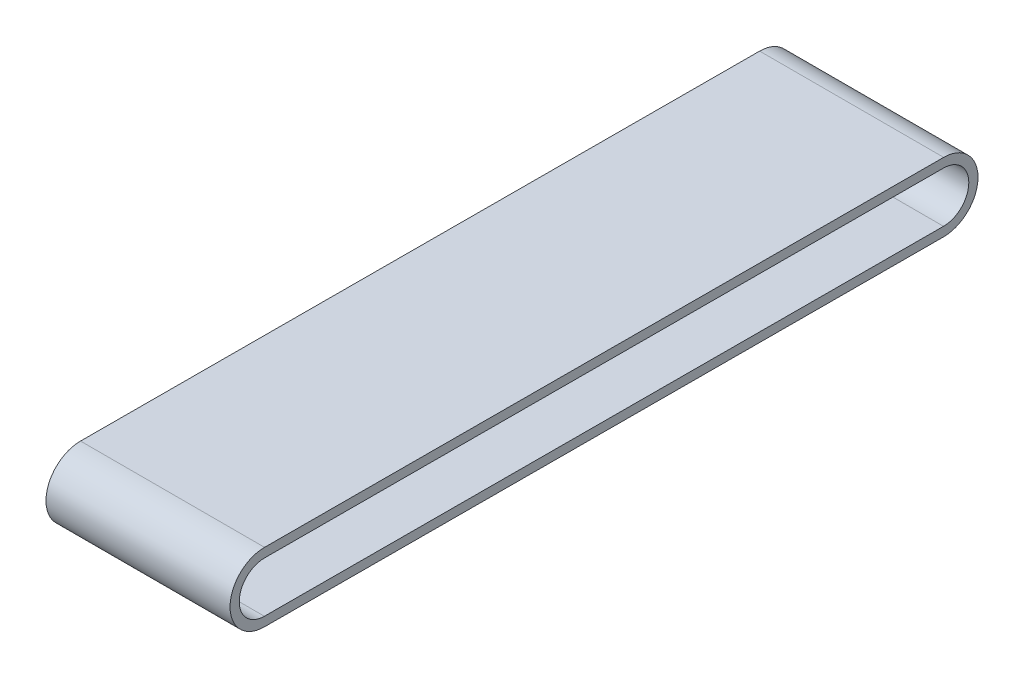
ISO-10303-21;
HEADER;
FILE_DESCRIPTION(('STEP AP214'),'2;1');
FILE_NAME('part.step','',(''),(''),'','','');
FILE_SCHEMA(('AUTOMOTIVE_DESIGN { 1 0 10303 214 1 1 1 1 }'));
ENDSEC;
DATA;
#1=APPLICATION_CONTEXT('core data for automotive mechanical design processes');
#2=APPLICATION_PROTOCOL_DEFINITION('international standard','automotive_design',2000,#1);
#3=PRODUCT_CONTEXT('',#1,'mechanical');
#4=PRODUCT('Part','Part','',(#3));
#5=PRODUCT_RELATED_PRODUCT_CATEGORY('part','',(#4));
#6=PRODUCT_DEFINITION_FORMATION('','',#4);
#7=PRODUCT_DEFINITION_CONTEXT('part definition',#1,'design');
#8=PRODUCT_DEFINITION('design','',#6,#7);
#9=PRODUCT_DEFINITION_SHAPE('','',#8);
#10=(LENGTH_UNIT() NAMED_UNIT(*) SI_UNIT(.MILLI.,.METRE.));
#11=(NAMED_UNIT(*) PLANE_ANGLE_UNIT() SI_UNIT($,.RADIAN.));
#12=(NAMED_UNIT(*) SI_UNIT($,.STERADIAN.) SOLID_ANGLE_UNIT());
#13=UNCERTAINTY_MEASURE_WITH_UNIT(LENGTH_MEASURE(1.E-05),#10,'distance_accuracy_value','');
#14=(GEOMETRIC_REPRESENTATION_CONTEXT(3) GLOBAL_UNCERTAINTY_ASSIGNED_CONTEXT((#13)) GLOBAL_UNIT_ASSIGNED_CONTEXT((#10,
#11,#12)) REPRESENTATION_CONTEXT('',''));
#15=CARTESIAN_POINT('',(0.,0.,0.));
#16=DIRECTION('',(0.,0.,1.));
#17=DIRECTION('',(1.,0.,0.));
#18=AXIS2_PLACEMENT_3D('',#15,#16,#17);
#19=CARTESIAN_POINT('',(50.8,81.28,-364.49));
#20=DIRECTION('',(1.,0.,0.));
#21=DIRECTION('',(0.,0.,-1.));
#22=AXIS2_PLACEMENT_3D('',#19,#20,#21);
#23=PLANE('',#22);
#24=CARTESIAN_POINT('',(50.8,81.28,-364.49));
#25=DIRECTION('',(1.,0.,0.));
#26=DIRECTION('',(0.,0.,-1.));
#27=AXIS2_PLACEMENT_3D('',#24,#25,#26);
#28=CIRCLE('',#27,18.9985840345285);
#29=CARTESIAN_POINT('',(50.8,100.278514269767,-364.541486488536));
#30=VERTEX_POINT('',#29);
#31=CARTESIAN_POINT('',(50.8,62.281485730233,-364.438513511464));
#32=VERTEX_POINT('',#31);
#33=EDGE_CURVE('E157',#30,#32,#28,.T.);
#34=ORIENTED_EDGE('',*,*,#33,.T.);
#35=DIRECTION('',(0.,-0.00271001714877075,-0.999996327896784));
#36=VECTOR('',#35,1.);
#37=CARTESIAN_POINT('',(50.8,62.281485730233,-364.438513511464));
#38=LINE('',#37,#36);
#39=CARTESIAN_POINT('',(50.8,61.2654857302334,-739.342513511464));
#40=VERTEX_POINT('',#39);
#41=EDGE_CURVE('E160',#32,#40,#38,.T.);
#42=ORIENTED_EDGE('',*,*,#41,.T.);
#43=CARTESIAN_POINT('',(50.8,80.2640000000005,-739.394));
#44=DIRECTION('',(1.,0.,0.));
#45=DIRECTION('',(0.,0.,-1.));
#46=AXIS2_PLACEMENT_3D('',#43,#44,#45);
#47=CIRCLE('',#46,18.9985840345286);
#48=CARTESIAN_POINT('',(50.8,99.2625142697675,-739.445486488536));
#49=VERTEX_POINT('',#48);
#50=EDGE_CURVE('E163',#40,#49,#47,.T.);
#51=ORIENTED_EDGE('',*,*,#50,.T.);
#52=DIRECTION('',(0.,0.00271001714877026,0.999996327896784));
#53=VECTOR('',#52,1.);
#54=CARTESIAN_POINT('',(50.8,99.2625142697675,-739.445486488536));
#55=LINE('',#54,#53);
#56=EDGE_CURVE('E165',#49,#30,#55,.T.);
#57=ORIENTED_EDGE('',*,*,#56,.T.);
#58=EDGE_LOOP('',(#34,#42,#51,#57));
#59=FACE_BOUND('',#58,.T.);
#60=DIRECTION('',(0.,-0.00271001714877075,-0.999996327896785));
#61=VECTOR('',#60,1.);
#62=CARTESIAN_POINT('',(50.8,67.3614670759487,-364.45228039858));
#63=LINE('',#62,#61);
#64=CARTESIAN_POINT('',(50.8,67.3614670759487,-364.45228039858));
#65=VERTEX_POINT('',#64);
#66=CARTESIAN_POINT('',(50.8,66.3454670759491,-739.35628039858));
#67=VERTEX_POINT('',#66);
#68=EDGE_CURVE('E129',#65,#67,#63,.T.);
#69=ORIENTED_EDGE('',*,*,#68,.F.);
#70=CARTESIAN_POINT('',(50.8,81.28,-364.49));
#71=DIRECTION('',(1.,0.,0.));
#72=DIRECTION('',(0.,0.,-1.));
#73=AXIS2_PLACEMENT_3D('',#70,#71,#72);
#74=CIRCLE('',#73,13.9185840345285);
#75=CARTESIAN_POINT('',(50.8,95.1985329240513,-364.52771960142));
#76=VERTEX_POINT('',#75);
#77=EDGE_CURVE('E121',#76,#65,#74,.T.);
#78=ORIENTED_EDGE('',*,*,#77,.F.);
#79=DIRECTION('',(0.,0.00271001714877026,0.999996327896785));
#80=VECTOR('',#79,1.);
#81=CARTESIAN_POINT('',(50.8,94.1825329240518,-739.43171960142));
#82=LINE('',#81,#80);
#83=CARTESIAN_POINT('',(50.8,94.1825329240518,-739.43171960142));
#84=VERTEX_POINT('',#83);
#85=EDGE_CURVE('E143',#84,#76,#82,.T.);
#86=ORIENTED_EDGE('',*,*,#85,.F.);
#87=CARTESIAN_POINT('',(50.8,80.2640000000005,-739.394));
#88=DIRECTION('',(1.,0.,0.));
#89=DIRECTION('',(0.,0.,-1.));
#90=AXIS2_PLACEMENT_3D('',#87,#88,#89);
#91=CIRCLE('',#90,13.9185840345286);
#92=EDGE_CURVE('E141',#67,#84,#91,.T.);
#93=ORIENTED_EDGE('',*,*,#92,.F.);
#94=EDGE_LOOP('',(#69,#78,#86,#93));
#95=FACE_BOUND('',#94,.T.);
#96=ADVANCED_FACE('F56',(#59,#95),#23,.T.);
#97=CARTESIAN_POINT('',(-50.8,81.28,-364.49));
#98=DIRECTION('',(1.,0.,0.));
#99=DIRECTION('',(0.,0.,-1.));
#100=AXIS2_PLACEMENT_3D('',#97,#98,#99);
#101=PLANE('',#100);
#102=CARTESIAN_POINT('',(-50.8,81.28,-364.49));
#103=DIRECTION('',(1.,0.,0.));
#104=DIRECTION('',(0.,0.,-1.));
#105=AXIS2_PLACEMENT_3D('',#102,#103,#104);
#106=CIRCLE('',#105,18.9985840345285);
#107=CARTESIAN_POINT('',(-50.8,100.278514269767,-364.541486488536));
#108=VERTEX_POINT('',#107);
#109=CARTESIAN_POINT('',(-50.8,62.281485730233,-364.438513511464));
#110=VERTEX_POINT('',#109);
#111=EDGE_CURVE('E137',#108,#110,#106,.T.);
#112=ORIENTED_EDGE('',*,*,#111,.F.);
#113=DIRECTION('',(0.,0.00271001714877026,0.999996327896784));
#114=VECTOR('',#113,1.);
#115=CARTESIAN_POINT('',(-50.8,99.2625142697675,-739.445486488536));
#116=LINE('',#115,#114);
#117=CARTESIAN_POINT('',(-50.8,99.2625142697675,-739.445486488536));
#118=VERTEX_POINT('',#117);
#119=EDGE_CURVE('E161',#118,#108,#116,.T.);
#120=ORIENTED_EDGE('',*,*,#119,.F.);
#121=CARTESIAN_POINT('',(-50.8,80.2640000000005,-739.394));
#122=DIRECTION('',(1.,0.,0.));
#123=DIRECTION('',(0.,0.,-1.));
#124=AXIS2_PLACEMENT_3D('',#121,#122,#123);
#125=CIRCLE('',#124,18.9985840345286);
#126=CARTESIAN_POINT('',(-50.8,61.2654857302334,-739.342513511464));
#127=VERTEX_POINT('',#126);
#128=EDGE_CURVE('E172',#127,#118,#125,.T.);
#129=ORIENTED_EDGE('',*,*,#128,.F.);
#130=DIRECTION('',(0.,-0.00271001714877075,-0.999996327896784));
#131=VECTOR('',#130,1.);
#132=CARTESIAN_POINT('',(-50.8,62.281485730233,-364.438513511464));
#133=LINE('',#132,#131);
#134=EDGE_CURVE('E170',#110,#127,#133,.T.);
#135=ORIENTED_EDGE('',*,*,#134,.F.);
#136=EDGE_LOOP('',(#112,#120,#129,#135));
#137=FACE_BOUND('',#136,.T.);
#138=CARTESIAN_POINT('',(-50.8,81.28,-364.49));
#139=DIRECTION('',(1.,0.,0.));
#140=DIRECTION('',(0.,0.,-1.));
#141=AXIS2_PLACEMENT_3D('',#138,#139,#140);
#142=CIRCLE('',#141,13.9185840345285);
#143=CARTESIAN_POINT('',(-50.8,95.1985329240513,-364.52771960142));
#144=VERTEX_POINT('',#143);
#145=CARTESIAN_POINT('',(-50.8,67.3614670759487,-364.45228039858));
#146=VERTEX_POINT('',#145);
#147=EDGE_CURVE('E79',#144,#146,#142,.T.);
#148=ORIENTED_EDGE('',*,*,#147,.T.);
#149=DIRECTION('',(0.,-0.00271001714877075,-0.999996327896785));
#150=VECTOR('',#149,1.);
#151=CARTESIAN_POINT('',(-50.8,67.3614670759487,-364.45228039858));
#152=LINE('',#151,#150);
#153=CARTESIAN_POINT('',(-50.8,66.3454670759491,-739.35628039858));
#154=VERTEX_POINT('',#153);
#155=EDGE_CURVE('E136',#146,#154,#152,.T.);
#156=ORIENTED_EDGE('',*,*,#155,.T.);
#157=CARTESIAN_POINT('',(-50.8,80.2640000000005,-739.394));
#158=DIRECTION('',(1.,0.,0.));
#159=DIRECTION('',(0.,0.,-1.));
#160=AXIS2_PLACEMENT_3D('',#157,#158,#159);
#161=CIRCLE('',#160,13.9185840345286);
#162=CARTESIAN_POINT('',(-50.8,94.1825329240518,-739.43171960142));
#163=VERTEX_POINT('',#162);
#164=EDGE_CURVE('E149',#154,#163,#161,.T.);
#165=ORIENTED_EDGE('',*,*,#164,.T.);
#166=DIRECTION('',(0.,0.00271001714877026,0.999996327896785));
#167=VECTOR('',#166,1.);
#168=CARTESIAN_POINT('',(-50.8,94.1825329240518,-739.43171960142));
#169=LINE('',#168,#167);
#170=EDGE_CURVE('E130',#163,#144,#169,.T.);
#171=ORIENTED_EDGE('',*,*,#170,.T.);
#172=EDGE_LOOP('',(#148,#156,#165,#171));
#173=FACE_BOUND('',#172,.T.);
#174=ADVANCED_FACE('F190',(#137,#173),#101,.F.);
#175=CARTESIAN_POINT('',(50.8,81.28,-364.49));
#176=DIRECTION('',(-1.,0.,0.));
#177=DIRECTION('',(0.,0.,1.));
#178=AXIS2_PLACEMENT_3D('',#175,#176,#177);
#179=CYLINDRICAL_SURFACE('',#178,18.9985840345285);
#180=ORIENTED_EDGE('',*,*,#111,.T.);
#181=DIRECTION('',(-1.,0.,0.));
#182=VECTOR('',#181,1.);
#183=CARTESIAN_POINT('',(50.8,62.281485730233,-364.438513511464));
#184=LINE('',#183,#182);
#185=EDGE_CURVE('E12',#32,#110,#184,.T.);
#186=ORIENTED_EDGE('',*,*,#185,.F.);
#187=ORIENTED_EDGE('',*,*,#33,.F.);
#188=DIRECTION('',(-1.,0.,0.));
#189=VECTOR('',#188,1.);
#190=CARTESIAN_POINT('',(50.8,100.278514269767,-364.541486488536));
#191=LINE('',#190,#189);
#192=EDGE_CURVE('E167',#30,#108,#191,.T.);
#193=ORIENTED_EDGE('',*,*,#192,.T.);
#194=EDGE_LOOP('',(#180,#186,#187,#193));
#195=FACE_BOUND('',#194,.T.);
#196=ADVANCED_FACE('F58',(#195),#179,.T.);
#197=CARTESIAN_POINT('',(50.8,62.281485730233,-364.438513511464));
#198=DIRECTION('',(0.,0.999996327896784,-0.00271001714877075));
#199=DIRECTION('',(0.,0.00271001714877075,0.999996327896784));
#200=AXIS2_PLACEMENT_3D('',#197,#198,#199);
#201=PLANE('',#200);
#202=ORIENTED_EDGE('',*,*,#134,.T.);
#203=DIRECTION('',(-1.,0.,0.));
#204=VECTOR('',#203,1.);
#205=CARTESIAN_POINT('',(50.8,61.2654857302334,-739.342513511464));
#206=LINE('',#205,#204);
#207=EDGE_CURVE('E64',#40,#127,#206,.T.);
#208=ORIENTED_EDGE('',*,*,#207,.F.);
#209=ORIENTED_EDGE('',*,*,#41,.F.);
#210=ORIENTED_EDGE('',*,*,#185,.T.);
#211=EDGE_LOOP('',(#202,#208,#209,#210));
#212=FACE_BOUND('',#211,.T.);
#213=ADVANCED_FACE('F200',(#212),#201,.F.);
#214=CARTESIAN_POINT('',(50.8,80.2640000000005,-739.394));
#215=DIRECTION('',(-1.,0.,0.));
#216=DIRECTION('',(0.,0.,1.));
#217=AXIS2_PLACEMENT_3D('',#214,#215,#216);
#218=CYLINDRICAL_SURFACE('',#217,18.9985840345286);
#219=ORIENTED_EDGE('',*,*,#128,.T.);
#220=DIRECTION('',(-1.,0.,0.));
#221=VECTOR('',#220,1.);
#222=CARTESIAN_POINT('',(50.8,99.2625142697675,-739.445486488536));
#223=LINE('',#222,#221);
#224=EDGE_CURVE('E177',#49,#118,#223,.T.);
#225=ORIENTED_EDGE('',*,*,#224,.F.);
#226=ORIENTED_EDGE('',*,*,#50,.F.);
#227=ORIENTED_EDGE('',*,*,#207,.T.);
#228=EDGE_LOOP('',(#219,#225,#226,#227));
#229=FACE_BOUND('',#228,.T.);
#230=ADVANCED_FACE('F184',(#229),#218,.T.);
#231=CARTESIAN_POINT('',(50.8,99.2625142697675,-739.445486488536));
#232=DIRECTION('',(0.,-0.999996327896784,0.00271001714877026));
#233=DIRECTION('',(0.,-0.00271001714877026,-0.999996327896784));
#234=AXIS2_PLACEMENT_3D('',#231,#232,#233);
#235=PLANE('',#234);
#236=ORIENTED_EDGE('',*,*,#119,.T.);
#237=ORIENTED_EDGE('',*,*,#192,.F.);
#238=ORIENTED_EDGE('',*,*,#56,.F.);
#239=ORIENTED_EDGE('',*,*,#224,.T.);
#240=EDGE_LOOP('',(#236,#237,#238,#239));
#241=FACE_BOUND('',#240,.T.);
#242=ADVANCED_FACE('F194',(#241),#235,.F.);
#243=CARTESIAN_POINT('',(50.8,81.28,-364.49));
#244=DIRECTION('',(-1.,0.,0.));
#245=DIRECTION('',(0.,0.,1.));
#246=AXIS2_PLACEMENT_3D('',#243,#244,#245);
#247=CYLINDRICAL_SURFACE('',#246,13.9185840345285);
#248=ORIENTED_EDGE('',*,*,#147,.F.);
#249=DIRECTION('',(-1.,0.,0.));
#250=VECTOR('',#249,1.);
#251=CARTESIAN_POINT('',(50.8,95.1985329240513,-364.52771960142));
#252=LINE('',#251,#250);
#253=EDGE_CURVE('E125',#76,#144,#252,.T.);
#254=ORIENTED_EDGE('',*,*,#253,.F.);
#255=ORIENTED_EDGE('',*,*,#77,.T.);
#256=DIRECTION('',(-1.,0.,0.));
#257=VECTOR('',#256,1.);
#258=CARTESIAN_POINT('',(50.8,67.3614670759487,-364.45228039858));
#259=LINE('',#258,#257);
#260=EDGE_CURVE('E124',#65,#146,#259,.T.);
#261=ORIENTED_EDGE('',*,*,#260,.T.);
#262=EDGE_LOOP('',(#248,#254,#255,#261));
#263=FACE_BOUND('',#262,.T.);
#264=ADVANCED_FACE('F123',(#263),#247,.F.);
#265=CARTESIAN_POINT('',(50.8,67.3614670759487,-364.45228039858));
#266=DIRECTION('',(0.,0.999996327896784,-0.00271001714877075));
#267=DIRECTION('',(0.,0.00271001714877075,0.999996327896784));
#268=AXIS2_PLACEMENT_3D('',#265,#266,#267);
#269=PLANE('',#268);
#270=ORIENTED_EDGE('',*,*,#155,.F.);
#271=ORIENTED_EDGE('',*,*,#260,.F.);
#272=ORIENTED_EDGE('',*,*,#68,.T.);
#273=DIRECTION('',(-1.,0.,0.));
#274=VECTOR('',#273,1.);
#275=CARTESIAN_POINT('',(50.8,66.3454670759491,-739.35628039858));
#276=LINE('',#275,#274);
#277=EDGE_CURVE('E138',#67,#154,#276,.T.);
#278=ORIENTED_EDGE('',*,*,#277,.T.);
#279=EDGE_LOOP('',(#270,#271,#272,#278));
#280=FACE_BOUND('',#279,.T.);
#281=ADVANCED_FACE('F133',(#280),#269,.T.);
#282=CARTESIAN_POINT('',(50.8,80.2640000000005,-739.394));
#283=DIRECTION('',(-1.,0.,0.));
#284=DIRECTION('',(0.,0.,1.));
#285=AXIS2_PLACEMENT_3D('',#282,#283,#284);
#286=CYLINDRICAL_SURFACE('',#285,13.9185840345286);
#287=ORIENTED_EDGE('',*,*,#164,.F.);
#288=ORIENTED_EDGE('',*,*,#277,.F.);
#289=ORIENTED_EDGE('',*,*,#92,.T.);
#290=DIRECTION('',(-1.,0.,0.));
#291=VECTOR('',#290,1.);
#292=CARTESIAN_POINT('',(50.8,94.1825329240518,-739.43171960142));
#293=LINE('',#292,#291);
#294=EDGE_CURVE('E71',#84,#163,#293,.T.);
#295=ORIENTED_EDGE('',*,*,#294,.T.);
#296=EDGE_LOOP('',(#287,#288,#289,#295));
#297=FACE_BOUND('',#296,.T.);
#298=ADVANCED_FACE('F223',(#297),#286,.F.);
#299=CARTESIAN_POINT('',(50.8,94.1825329240518,-739.43171960142));
#300=DIRECTION('',(0.,-0.999996327896784,0.00271001714877026));
#301=DIRECTION('',(0.,-0.00271001714877026,-0.999996327896784));
#302=AXIS2_PLACEMENT_3D('',#299,#300,#301);
#303=PLANE('',#302);
#304=ORIENTED_EDGE('',*,*,#170,.F.);
#305=ORIENTED_EDGE('',*,*,#294,.F.);
#306=ORIENTED_EDGE('',*,*,#85,.T.);
#307=ORIENTED_EDGE('',*,*,#253,.T.);
#308=EDGE_LOOP('',(#304,#305,#306,#307));
#309=FACE_BOUND('',#308,.T.);
#310=ADVANCED_FACE('F227',(#309),#303,.T.);
#311=CLOSED_SHELL('',(#96,#174,#196,#213,#230,#242,#264,#281,#298,#310));
#312=MANIFOLD_SOLID_BREP('B2',#311);
#313=ADVANCED_BREP_SHAPE_REPRESENTATION('',(#18,#312),#14);
#314=SHAPE_DEFINITION_REPRESENTATION(#9,#313);
ENDSEC;
END-ISO-10303-21;
